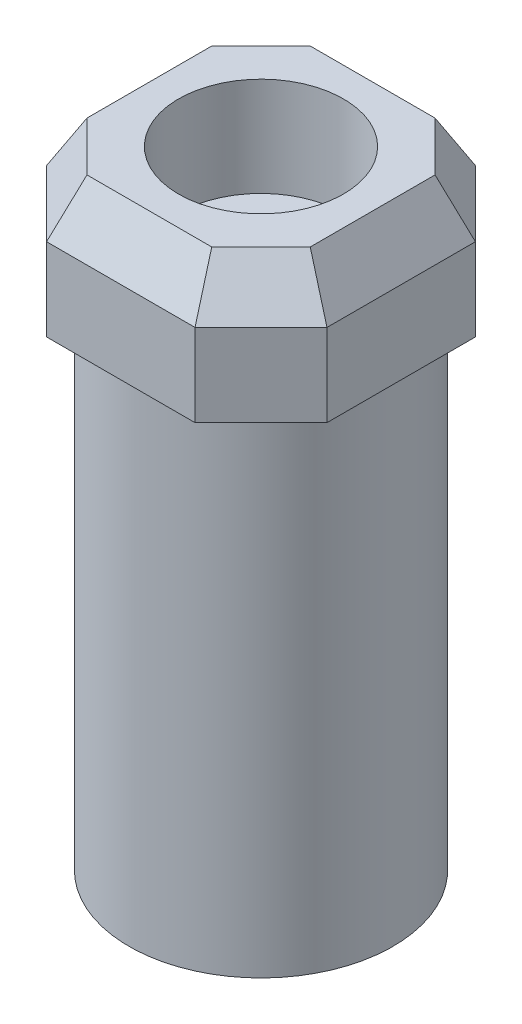
ISO-10303-21;
HEADER;
FILE_DESCRIPTION(('STEP AP214'),'2;1');
FILE_NAME('part.step','',(''),(''),'','','');
FILE_SCHEMA(('AUTOMOTIVE_DESIGN { 1 0 10303 214 1 1 1 1 }'));
ENDSEC;
DATA;
#1=APPLICATION_CONTEXT('core data for automotive mechanical design processes');
#2=APPLICATION_PROTOCOL_DEFINITION('international standard','automotive_design',2000,#1);
#3=PRODUCT_CONTEXT('',#1,'mechanical');
#4=PRODUCT('Part','Part','',(#3));
#5=PRODUCT_RELATED_PRODUCT_CATEGORY('part','',(#4));
#6=PRODUCT_DEFINITION_FORMATION('','',#4);
#7=PRODUCT_DEFINITION_CONTEXT('part definition',#1,'design');
#8=PRODUCT_DEFINITION('design','',#6,#7);
#9=PRODUCT_DEFINITION_SHAPE('','',#8);
#10=(LENGTH_UNIT() NAMED_UNIT(*) SI_UNIT(.MILLI.,.METRE.));
#11=(NAMED_UNIT(*) PLANE_ANGLE_UNIT() SI_UNIT($,.RADIAN.));
#12=(NAMED_UNIT(*) SI_UNIT($,.STERADIAN.) SOLID_ANGLE_UNIT());
#13=UNCERTAINTY_MEASURE_WITH_UNIT(LENGTH_MEASURE(1.E-05),#10,'distance_accuracy_value','');
#14=(GEOMETRIC_REPRESENTATION_CONTEXT(3) GLOBAL_UNCERTAINTY_ASSIGNED_CONTEXT((#13)) GLOBAL_UNIT_ASSIGNED_CONTEXT((#10,
#11,#12)) REPRESENTATION_CONTEXT('',''));
#15=CARTESIAN_POINT('',(0.,0.,0.));
#16=DIRECTION('',(0.,0.,1.));
#17=DIRECTION('',(1.,0.,0.));
#18=AXIS2_PLACEMENT_3D('',#15,#16,#17);
#19=CARTESIAN_POINT('',(8.5,8.,-8.5));
#20=DIRECTION('',(-1.,0.,0.));
#21=DIRECTION('',(0.,0.,1.));
#22=AXIS2_PLACEMENT_3D('',#19,#20,#21);
#23=PLANE('',#22);
#24=DIRECTION('',(0.,1.,0.));
#25=VECTOR('',#24,1.);
#26=CARTESIAN_POINT('',(8.5,8.,-4.49999999999999));
#27=LINE('',#26,#25);
#28=CARTESIAN_POINT('',(8.5,0.,-4.49999999999999));
#29=VERTEX_POINT('',#28);
#30=CARTESIAN_POINT('',(8.5,4.99999999999998,-4.49999999999999));
#31=VERTEX_POINT('',#30);
#32=EDGE_CURVE('E393',#29,#31,#27,.T.);
#33=ORIENTED_EDGE('',*,*,#32,.T.);
#34=DIRECTION('',(0.,0.,1.));
#35=VECTOR('',#34,1.);
#36=CARTESIAN_POINT('',(8.5,4.99999999999998,4.5));
#37=LINE('',#36,#35);
#38=CARTESIAN_POINT('',(8.5,4.99999999999998,4.5));
#39=VERTEX_POINT('',#38);
#40=EDGE_CURVE('E59',#31,#39,#37,.T.);
#41=ORIENTED_EDGE('',*,*,#40,.T.);
#42=DIRECTION('',(0.,-1.,0.));
#43=VECTOR('',#42,1.);
#44=CARTESIAN_POINT('',(8.5,8.,4.5));
#45=LINE('',#44,#43);
#46=CARTESIAN_POINT('',(8.5,0.,4.5));
#47=VERTEX_POINT('',#46);
#48=EDGE_CURVE('E391',#39,#47,#45,.T.);
#49=ORIENTED_EDGE('',*,*,#48,.T.);
#50=DIRECTION('',(0.,0.,-1.));
#51=VECTOR('',#50,1.);
#52=CARTESIAN_POINT('',(8.5,0.,-8.5));
#53=LINE('',#52,#51);
#54=EDGE_CURVE('E435',#47,#29,#53,.T.);
#55=ORIENTED_EDGE('',*,*,#54,.T.);
#56=EDGE_LOOP('',(#33,#41,#49,#55));
#57=FACE_BOUND('',#56,.T.);
#58=ADVANCED_FACE('F35',(#57),#23,.F.);
#59=CARTESIAN_POINT('',(-8.5,8.,-8.5));
#60=DIRECTION('',(0.,0.,1.));
#61=DIRECTION('',(1.,0.,0.));
#62=AXIS2_PLACEMENT_3D('',#59,#60,#61);
#63=PLANE('',#62);
#64=DIRECTION('',(0.,1.,0.));
#65=VECTOR('',#64,1.);
#66=CARTESIAN_POINT('',(-4.49999999999999,8.,-8.5));
#67=LINE('',#66,#65);
#68=CARTESIAN_POINT('',(-4.49999999999999,0.,-8.5));
#69=VERTEX_POINT('',#68);
#70=CARTESIAN_POINT('',(-4.49999999999999,4.99999999999998,-8.5));
#71=VERTEX_POINT('',#70);
#72=EDGE_CURVE('E386',#69,#71,#67,.T.);
#73=ORIENTED_EDGE('',*,*,#72,.T.);
#74=DIRECTION('',(1.,0.,0.));
#75=VECTOR('',#74,1.);
#76=CARTESIAN_POINT('',(4.5,4.99999999999998,-8.5));
#77=LINE('',#76,#75);
#78=CARTESIAN_POINT('',(4.5,4.99999999999998,-8.5));
#79=VERTEX_POINT('',#78);
#80=EDGE_CURVE('E333',#71,#79,#77,.T.);
#81=ORIENTED_EDGE('',*,*,#80,.T.);
#82=DIRECTION('',(0.,-1.,0.));
#83=VECTOR('',#82,1.);
#84=CARTESIAN_POINT('',(4.5,8.,-8.5));
#85=LINE('',#84,#83);
#86=CARTESIAN_POINT('',(4.5,0.,-8.5));
#87=VERTEX_POINT('',#86);
#88=EDGE_CURVE('E389',#79,#87,#85,.T.);
#89=ORIENTED_EDGE('',*,*,#88,.T.);
#90=DIRECTION('',(-1.,0.,0.));
#91=VECTOR('',#90,1.);
#92=CARTESIAN_POINT('',(-8.5,0.,-8.5));
#93=LINE('',#92,#91);
#94=EDGE_CURVE('E431',#87,#69,#93,.T.);
#95=ORIENTED_EDGE('',*,*,#94,.T.);
#96=EDGE_LOOP('',(#73,#81,#89,#95));
#97=FACE_BOUND('',#96,.T.);
#98=ADVANCED_FACE('F275',(#97),#63,.F.);
#99=CARTESIAN_POINT('',(-8.5,8.,-8.5));
#100=DIRECTION('',(1.,0.,0.));
#101=DIRECTION('',(0.,0.,-1.));
#102=AXIS2_PLACEMENT_3D('',#99,#100,#101);
#103=PLANE('',#102);
#104=DIRECTION('',(0.,1.,0.));
#105=VECTOR('',#104,1.);
#106=CARTESIAN_POINT('',(-8.5,8.,4.49999999999999));
#107=LINE('',#106,#105);
#108=CARTESIAN_POINT('',(-8.5,0.,4.49999999999999));
#109=VERTEX_POINT('',#108);
#110=CARTESIAN_POINT('',(-8.5,4.99999999999998,4.49999999999999));
#111=VERTEX_POINT('',#110);
#112=EDGE_CURVE('E395',#109,#111,#107,.T.);
#113=ORIENTED_EDGE('',*,*,#112,.T.);
#114=DIRECTION('',(0.,0.,-1.));
#115=VECTOR('',#114,1.);
#116=CARTESIAN_POINT('',(-8.5,4.99999999999998,-4.5));
#117=LINE('',#116,#115);
#118=CARTESIAN_POINT('',(-8.5,4.99999999999998,-4.5));
#119=VERTEX_POINT('',#118);
#120=EDGE_CURVE('E365',#111,#119,#117,.T.);
#121=ORIENTED_EDGE('',*,*,#120,.T.);
#122=DIRECTION('',(0.,-1.,0.));
#123=VECTOR('',#122,1.);
#124=CARTESIAN_POINT('',(-8.5,8.,-4.5));
#125=LINE('',#124,#123);
#126=CARTESIAN_POINT('',(-8.5,0.,-4.5));
#127=VERTEX_POINT('',#126);
#128=EDGE_CURVE('E398',#119,#127,#125,.T.);
#129=ORIENTED_EDGE('',*,*,#128,.T.);
#130=DIRECTION('',(0.,0.,1.));
#131=VECTOR('',#130,1.);
#132=CARTESIAN_POINT('',(-8.5,0.,-8.5));
#133=LINE('',#132,#131);
#134=EDGE_CURVE('E428',#127,#109,#133,.T.);
#135=ORIENTED_EDGE('',*,*,#134,.T.);
#136=EDGE_LOOP('',(#113,#121,#129,#135));
#137=FACE_BOUND('',#136,.T.);
#138=ADVANCED_FACE('F271',(#137),#103,.F.);
#139=CARTESIAN_POINT('',(-8.5,8.,8.5));
#140=DIRECTION('',(0.,0.,-1.));
#141=DIRECTION('',(-1.,0.,0.));
#142=AXIS2_PLACEMENT_3D('',#139,#140,#141);
#143=PLANE('',#142);
#144=DIRECTION('',(0.,1.,0.));
#145=VECTOR('',#144,1.);
#146=CARTESIAN_POINT('',(4.49999999999999,8.,8.5));
#147=LINE('',#146,#145);
#148=CARTESIAN_POINT('',(4.49999999999999,0.,8.5));
#149=VERTEX_POINT('',#148);
#150=CARTESIAN_POINT('',(4.49999999999999,4.99999999999998,8.5));
#151=VERTEX_POINT('',#150);
#152=EDGE_CURVE('E210',#149,#151,#147,.T.);
#153=ORIENTED_EDGE('',*,*,#152,.T.);
#154=DIRECTION('',(-1.,0.,0.));
#155=VECTOR('',#154,1.);
#156=CARTESIAN_POINT('',(-4.5,4.99999999999998,8.5));
#157=LINE('',#156,#155);
#158=CARTESIAN_POINT('',(-4.5,4.99999999999998,8.5));
#159=VERTEX_POINT('',#158);
#160=EDGE_CURVE('E11',#151,#159,#157,.T.);
#161=ORIENTED_EDGE('',*,*,#160,.T.);
#162=DIRECTION('',(0.,-1.,0.));
#163=VECTOR('',#162,1.);
#164=CARTESIAN_POINT('',(-4.5,8.,8.5));
#165=LINE('',#164,#163);
#166=CARTESIAN_POINT('',(-4.5,0.,8.5));
#167=VERTEX_POINT('',#166);
#168=EDGE_CURVE('E407',#159,#167,#165,.T.);
#169=ORIENTED_EDGE('',*,*,#168,.T.);
#170=DIRECTION('',(1.,0.,0.));
#171=VECTOR('',#170,1.);
#172=CARTESIAN_POINT('',(-8.5,0.,8.5));
#173=LINE('',#172,#171);
#174=EDGE_CURVE('E414',#167,#149,#173,.T.);
#175=ORIENTED_EDGE('',*,*,#174,.T.);
#176=EDGE_LOOP('',(#153,#161,#169,#175));
#177=FACE_BOUND('',#176,.T.);
#178=ADVANCED_FACE('F263',(#177),#143,.F.);
#179=CARTESIAN_POINT('',(0.,8.,0.));
#180=DIRECTION('',(0.,1.,0.));
#181=DIRECTION('',(0.,0.,1.));
#182=AXIS2_PLACEMENT_3D('',#179,#180,#181);
#183=PLANE('',#182);
#184=DIRECTION('',(0.,0.,1.));
#185=VECTOR('',#184,1.);
#186=CARTESIAN_POINT('',(-6.76794919243112,8.,4.49999999999999));
#187=LINE('',#186,#185);
#188=CARTESIAN_POINT('',(-6.76794919243112,8.,-3.7825610647857));
#189=VERTEX_POINT('',#188);
#190=CARTESIAN_POINT('',(-6.76794919243112,8.,3.78256106478569));
#191=VERTEX_POINT('',#190);
#192=EDGE_CURVE('E373',#189,#191,#187,.T.);
#193=ORIENTED_EDGE('',*,*,#192,.T.);
#194=DIRECTION('',(0.707106781186546,0.,0.707106781186549));
#195=VECTOR('',#194,1.);
#196=CARTESIAN_POINT('',(-5.27525512860842,8.,5.2752551286084));
#197=LINE('',#196,#195);
#198=CARTESIAN_POINT('',(-3.7825610647857,8.,6.76794919243112));
#199=VERTEX_POINT('',#198);
#200=EDGE_CURVE('E370',#191,#199,#197,.T.);
#201=ORIENTED_EDGE('',*,*,#200,.T.);
#202=DIRECTION('',(1.,0.,0.));
#203=VECTOR('',#202,1.);
#204=CARTESIAN_POINT('',(4.49999999999999,8.,6.76794919243112));
#205=LINE('',#204,#203);
#206=CARTESIAN_POINT('',(3.78256106478569,8.,6.76794919243112));
#207=VERTEX_POINT('',#206);
#208=EDGE_CURVE('E384',#199,#207,#205,.T.);
#209=ORIENTED_EDGE('',*,*,#208,.T.);
#210=DIRECTION('',(0.707106781186549,0.,-0.707106781186546));
#211=VECTOR('',#210,1.);
#212=CARTESIAN_POINT('',(5.2752551286084,8.,5.27525512860842));
#213=LINE('',#212,#211);
#214=CARTESIAN_POINT('',(6.76794919243112,8.,3.7825610647857));
#215=VERTEX_POINT('',#214);
#216=EDGE_CURVE('E382',#207,#215,#213,.T.);
#217=ORIENTED_EDGE('',*,*,#216,.T.);
#218=DIRECTION('',(0.,0.,-1.));
#219=VECTOR('',#218,1.);
#220=CARTESIAN_POINT('',(6.76794919243112,8.,-4.49999999999999));
#221=LINE('',#220,#219);
#222=CARTESIAN_POINT('',(6.76794919243112,8.,-3.78256106478569));
#223=VERTEX_POINT('',#222);
#224=EDGE_CURVE('E380',#215,#223,#221,.T.);
#225=ORIENTED_EDGE('',*,*,#224,.T.);
#226=DIRECTION('',(-0.707106781186546,0.,-0.707106781186549));
#227=VECTOR('',#226,1.);
#228=CARTESIAN_POINT('',(5.27525512860842,8.,-5.2752551286084));
#229=LINE('',#228,#227);
#230=CARTESIAN_POINT('',(3.7825610647857,8.,-6.76794919243112));
#231=VERTEX_POINT('',#230);
#232=EDGE_CURVE('E378',#223,#231,#229,.T.);
#233=ORIENTED_EDGE('',*,*,#232,.T.);
#234=DIRECTION('',(-1.,0.,0.));
#235=VECTOR('',#234,1.);
#236=CARTESIAN_POINT('',(-4.49999999999999,8.,-6.76794919243112));
#237=LINE('',#236,#235);
#238=CARTESIAN_POINT('',(-3.78256106478569,8.,-6.76794919243112));
#239=VERTEX_POINT('',#238);
#240=EDGE_CURVE('E335',#231,#239,#237,.T.);
#241=ORIENTED_EDGE('',*,*,#240,.T.);
#242=DIRECTION('',(-0.707106781186549,0.,0.707106781186546));
#243=VECTOR('',#242,1.);
#244=CARTESIAN_POINT('',(-5.2752551286084,8.,-5.27525512860842));
#245=LINE('',#244,#243);
#246=EDGE_CURVE('E375',#239,#189,#245,.T.);
#247=ORIENTED_EDGE('',*,*,#246,.T.);
#248=EDGE_LOOP('',(#193,#201,#209,#217,#225,#233,#241,#247));
#249=FACE_BOUND('',#248,.T.);
#250=CARTESIAN_POINT('',(0.,8.,0.));
#251=DIRECTION('',(0.,1.,0.));
#252=DIRECTION('',(0.,0.,1.));
#253=AXIS2_PLACEMENT_3D('',#250,#251,#252);
#254=CIRCLE('',#253,5.);
#255=CARTESIAN_POINT('',(0.,8.,5.));
#256=VERTEX_POINT('',#255);
#257=EDGE_CURVE('E246',#256,#256,#254,.T.);
#258=ORIENTED_EDGE('',*,*,#257,.F.);
#259=EDGE_LOOP('',(#258));
#260=FACE_BOUND('',#259,.T.);
#261=ADVANCED_FACE('F260',(#249,#260),#183,.T.);
#262=CARTESIAN_POINT('',(0.,0.,0.));
#263=DIRECTION('',(0.,1.,0.));
#264=DIRECTION('',(0.,0.,1.));
#265=AXIS2_PLACEMENT_3D('',#262,#263,#264);
#266=PLANE('',#265);
#267=CARTESIAN_POINT('',(0.,0.,0.));
#268=DIRECTION('',(0.,-1.,0.));
#269=DIRECTION('',(0.,0.,-1.));
#270=AXIS2_PLACEMENT_3D('',#267,#268,#269);
#271=CIRCLE('',#270,8.);
#272=CARTESIAN_POINT('',(0.,0.,-8.));
#273=VERTEX_POINT('',#272);
#274=EDGE_CURVE('E433',#273,#273,#271,.T.);
#275=ORIENTED_EDGE('',*,*,#274,.F.);
#276=EDGE_LOOP('',(#275));
#277=FACE_BOUND('',#276,.T.);
#278=ORIENTED_EDGE('',*,*,#174,.F.);
#279=DIRECTION('',(0.707106781186546,0.,0.707106781186549));
#280=VECTOR('',#279,1.);
#281=CARTESIAN_POINT('',(-4.5,0.,8.5));
#282=LINE('',#281,#280);
#283=EDGE_CURVE('E400',#167,#109,#282,.F.);
#284=ORIENTED_EDGE('',*,*,#283,.T.);
#285=ORIENTED_EDGE('',*,*,#134,.F.);
#286=DIRECTION('',(-0.707106781186549,0.,0.707106781186546));
#287=VECTOR('',#286,1.);
#288=CARTESIAN_POINT('',(-8.5,0.,-4.5));
#289=LINE('',#288,#287);
#290=EDGE_CURVE('E404',#127,#69,#289,.F.);
#291=ORIENTED_EDGE('',*,*,#290,.T.);
#292=ORIENTED_EDGE('',*,*,#94,.F.);
#293=DIRECTION('',(-0.707106781186546,0.,-0.707106781186549));
#294=VECTOR('',#293,1.);
#295=CARTESIAN_POINT('',(4.5,0.,-8.5));
#296=LINE('',#295,#294);
#297=EDGE_CURVE('E406',#87,#29,#296,.F.);
#298=ORIENTED_EDGE('',*,*,#297,.T.);
#299=ORIENTED_EDGE('',*,*,#54,.F.);
#300=DIRECTION('',(0.707106781186549,0.,-0.707106781186546));
#301=VECTOR('',#300,1.);
#302=CARTESIAN_POINT('',(8.5,0.,4.5));
#303=LINE('',#302,#301);
#304=EDGE_CURVE('E402',#47,#149,#303,.F.);
#305=ORIENTED_EDGE('',*,*,#304,.T.);
#306=EDGE_LOOP('',(#278,#284,#285,#291,#292,#298,#299,#305));
#307=FACE_BOUND('',#306,.T.);
#308=ADVANCED_FACE('F262',(#277,#307),#266,.F.);
#309=CARTESIAN_POINT('',(0.,-30.,0.));
#310=DIRECTION('',(0.,1.,0.));
#311=DIRECTION('',(0.,0.,1.));
#312=AXIS2_PLACEMENT_3D('',#309,#310,#311);
#313=CYLINDRICAL_SURFACE('',#312,8.);
#314=DIRECTION('',(0.,1.,0.));
#315=VECTOR('',#314,1.);
#316=CARTESIAN_POINT('',(-7.87654746700609,-30.,-1.4));
#317=LINE('',#316,#315);
#318=CARTESIAN_POINT('',(-7.87654746700609,-20.,-1.4));
#319=VERTEX_POINT('',#318);
#320=CARTESIAN_POINT('',(-7.87654746700609,-9.99999999999999,-1.4));
#321=VERTEX_POINT('',#320);
#322=EDGE_CURVE('E176',#319,#321,#317,.T.);
#323=ORIENTED_EDGE('',*,*,#322,.T.);
#324=CARTESIAN_POINT('',(-7.87654746700609,-9.99999999999999,-1.4));
#325=CARTESIAN_POINT('',(-7.87654574469843,-9.96093397030719,-1.40000009786618));
#326=CARTESIAN_POINT('',(-7.8768384762062,-9.92188695701644,-1.39836380016015));
#327=CARTESIAN_POINT('',(-7.8779948217706,-9.84407833734187,-1.39183829938028));
#328=CARTESIAN_POINT('',(-7.87885837556585,-9.80531670126767,-1.38694943967712));
#329=CARTESIAN_POINT('',(-7.8822732761393,-9.6899892529084,-1.36746218160885));
#330=CARTESIAN_POINT('',(-7.88564901953597,-9.61420543913664,-1.3480428980196));
#331=CARTESIAN_POINT('',(-7.89421512934006,-9.4670385735415,-1.29693109800066));
#332=CARTESIAN_POINT('',(-7.89940584831672,-9.39565637992921,-1.26523619683416));
#333=CARTESIAN_POINT('',(-7.91101449635689,-9.25920739075039,-1.19049353674434));
#334=CARTESIAN_POINT('',(-7.91743246739731,-9.19414081131783,-1.14744538947564));
#335=CARTESIAN_POINT('',(-7.93084923122589,-9.07149091891836,-1.05072823535329));
#336=CARTESIAN_POINT('',(-7.93785301176315,-9.01398550560457,-0.996961164059506));
#337=CARTESIAN_POINT('',(-7.95160880716072,-8.90875743349266,-0.880537997859972));
#338=CARTESIAN_POINT('',(-7.95836078321537,-8.8610362774935,-0.817880539945022));
#339=CARTESIAN_POINT('',(-7.97090502697085,-8.77644188998031,-0.684947077776653));
#340=CARTESIAN_POINT('',(-7.976690681629,-8.73964216771898,-0.614623618589111));
#341=CARTESIAN_POINT('',(-7.98659394079379,-8.67840974350942,-0.468678770975305));
#342=CARTESIAN_POINT('',(-7.99071175859141,-8.65397546010981,-0.393058061438554));
#343=CARTESIAN_POINT('',(-7.99678029416812,-8.61840614341496,-0.239475359665924));
#344=CARTESIAN_POINT('',(-7.99875256213273,-8.60713877306312,-0.161544881809643));
#345=CARTESIAN_POINT('',(-8.0003819333325,-8.59781120881386,-0.00487445683871393));
#346=CARTESIAN_POINT('',(-8.00003915468235,-8.59975034111497,0.0738654487739149));
#347=CARTESIAN_POINT('',(-7.99709394178176,-8.6166786850046,0.229009686691875));
#348=CARTESIAN_POINT('',(-7.99451623364918,-8.63152510187836,0.305430136669221));
#349=CARTESIAN_POINT('',(-7.98741844860293,-8.67362124959126,0.454677627425671));
#350=CARTESIAN_POINT('',(-7.98289832069316,-8.70087130607544,0.527504573805323));
#351=CARTESIAN_POINT('',(-7.97238168375758,-8.7671413324401,0.667920102703323));
#352=CARTESIAN_POINT('',(-7.96637788183609,-8.80621966338937,0.735480572674119));
#353=CARTESIAN_POINT('',(-7.95356006477443,-8.8949927822457,0.863136260712703));
#354=CARTESIAN_POINT('',(-7.94674600670749,-8.94468813274591,0.923231082910747));
#355=CARTESIAN_POINT('',(-7.93295739936767,-9.05406710229683,1.03508974126972));
#356=CARTESIAN_POINT('',(-7.9259819198816,-9.11387434221804,1.08673264037877));
#357=CARTESIAN_POINT('',(-7.91274159538071,-9.24138780999238,1.17928532325297));
#358=CARTESIAN_POINT('',(-7.90647695165362,-9.30909626428114,1.22019207114118));
#359=CARTESIAN_POINT('',(-7.89536581227968,-9.45064781489396,1.29013963762815));
#360=CARTESIAN_POINT('',(-7.89052202646695,-9.52450229300594,1.31915782383543));
#361=CARTESIAN_POINT('',(-7.88284318592593,-9.67609155180291,1.36430073711403));
#362=CARTESIAN_POINT('',(-7.8800051322167,-9.75382035247864,1.38044471842302));
#363=CARTESIAN_POINT('',(-7.87773953725719,-9.86012293076048,1.393278781654));
#364=CARTESIAN_POINT('',(-7.87729293093619,-9.88806168482209,1.39580025127285));
#365=CARTESIAN_POINT('',(-7.8766971845825,-9.9439961894872,1.3991586844045));
#366=CARTESIAN_POINT('',(-7.87654754447313,-9.97199176466891,1.39999847979662));
#367=CARTESIAN_POINT('',(-7.87654746700609,-10.,1.4));
#368=B_SPLINE_CURVE_WITH_KNOTS('',3,(#324,#325,#326,#327,#328,#329,#330,#331,#332,#333,#334,
#335,#336,#337,#338,#339,#340,#341,#342,#343,#344,#345,#346,#347,#348,#349,#350,#351,#352,#353,
#354,#355,#356,#357,#358,#359,#360,#361,#362,#363,#364,#365,#366,#367),.UNSPECIFIED.,.F.,.F.,(4,
2,2,2,2,2,2,2,2,2,2,2,2,2,2,2,2,2,2,2,2,4),(0.,0.117125139690623,0.234237916524813,
0.467943868104823,0.701695243628187,0.935454615811017,1.17145978462551,1.40750117520477,
1.64509702944765,1.88266248919239,2.11781912824827,2.35296376960083,2.58553961465608,
2.81812156610757,3.05187032668944,3.28563147663181,3.52248998747965,3.75941540316371,
3.99678978380537,4.2338084858226,4.31793672944708,4.40192318457736),.UNSPECIFIED.);
#369=CARTESIAN_POINT('',(-7.87654746700609,-10.,1.4));
#370=VERTEX_POINT('',#369);
#371=EDGE_CURVE('E166',#321,#370,#368,.T.);
#372=ORIENTED_EDGE('',*,*,#371,.T.);
#373=DIRECTION('',(0.,1.,0.));
#374=VECTOR('',#373,1.);
#375=CARTESIAN_POINT('',(-7.87654746700609,-30.,1.4));
#376=LINE('',#375,#374);
#377=CARTESIAN_POINT('',(-7.87654746700609,-20.,1.4));
#378=VERTEX_POINT('',#377);
#379=EDGE_CURVE('E149',#370,#378,#376,.F.);
#380=ORIENTED_EDGE('',*,*,#379,.T.);
#381=CARTESIAN_POINT('',(-7.87654746700609,-20.,1.4));
#382=CARTESIAN_POINT('',(-7.87654574469844,-20.0390660296928,1.40000009786618));
#383=CARTESIAN_POINT('',(-7.87683847620621,-20.0781130429836,1.39836380016014));
#384=CARTESIAN_POINT('',(-7.8779948217706,-20.1559216626581,1.39183829938028));
#385=CARTESIAN_POINT('',(-7.87885837556585,-20.1946832987323,1.38694943967712));
#386=CARTESIAN_POINT('',(-7.8822732761393,-20.3100107470916,1.36746218160885));
#387=CARTESIAN_POINT('',(-7.88564901953597,-20.3857945608634,1.3480428980196));
#388=CARTESIAN_POINT('',(-7.89421512934006,-20.5329614264585,1.29693109800066));
#389=CARTESIAN_POINT('',(-7.89940584831672,-20.6043436200708,1.26523619683416));
#390=CARTESIAN_POINT('',(-7.91101449635689,-20.7407926092496,1.19049353674434));
#391=CARTESIAN_POINT('',(-7.91743246739731,-20.8058591886822,1.14744538947564));
#392=CARTESIAN_POINT('',(-7.93084923122589,-20.9285090810816,1.0507282353533));
#393=CARTESIAN_POINT('',(-7.93785301176315,-20.9860144943954,0.99696116405951));
#394=CARTESIAN_POINT('',(-7.95160880716072,-21.0912425665073,0.880537997859976));
#395=CARTESIAN_POINT('',(-7.95836078321537,-21.1389637225065,0.817880539945025));
#396=CARTESIAN_POINT('',(-7.97090502697085,-21.2235581100197,0.684947077776657));
#397=CARTESIAN_POINT('',(-7.976690681629,-21.260357832281,0.614623618589116));
#398=CARTESIAN_POINT('',(-7.98659394079379,-21.3215902564906,0.468678770975312));
#399=CARTESIAN_POINT('',(-7.99071175859141,-21.3460245398902,0.393058061438562));
#400=CARTESIAN_POINT('',(-7.99678029416812,-21.381593856585,0.239475359665932));
#401=CARTESIAN_POINT('',(-7.99875256213273,-21.3928612269369,0.16154488180965));
#402=CARTESIAN_POINT('',(-8.0003819333325,-21.4021887911861,0.00487445683872125));
#403=CARTESIAN_POINT('',(-8.00003915468235,-21.400249658885,-0.0738654487739076));
#404=CARTESIAN_POINT('',(-7.99709394178176,-21.3833213149954,-0.229009686691868));
#405=CARTESIAN_POINT('',(-7.99451623364918,-21.3684748981216,-0.305430136669214));
#406=CARTESIAN_POINT('',(-7.98741844860293,-21.3263787504087,-0.454677627425665));
#407=CARTESIAN_POINT('',(-7.98289832069316,-21.2991286939246,-0.527504573805317));
#408=CARTESIAN_POINT('',(-7.97238168375758,-21.2328586675599,-0.667920102703318));
#409=CARTESIAN_POINT('',(-7.96637788183609,-21.1937803366106,-0.735480572674115));
#410=CARTESIAN_POINT('',(-7.95356006477443,-21.1050072177543,-0.8631362607127));
#411=CARTESIAN_POINT('',(-7.94674600670749,-21.0553118672541,-0.923231082910742));
#412=CARTESIAN_POINT('',(-7.93295739936767,-20.9459328977032,-1.03508974126972));
#413=CARTESIAN_POINT('',(-7.9259819198816,-20.886125657782,-1.08673264037876));
#414=CARTESIAN_POINT('',(-7.91274159538071,-20.7586121900076,-1.17928532325297));
#415=CARTESIAN_POINT('',(-7.90647695165362,-20.6909037357189,-1.22019207114118));
#416=CARTESIAN_POINT('',(-7.89536581227968,-20.5493521851061,-1.29013963762815));
#417=CARTESIAN_POINT('',(-7.89052202646695,-20.4754977069941,-1.31915782383543));
#418=CARTESIAN_POINT('',(-7.88284318592593,-20.3239084481971,-1.36430073711404));
#419=CARTESIAN_POINT('',(-7.8800051322167,-20.2461796475214,-1.38044471842302));
#420=CARTESIAN_POINT('',(-7.87773953725719,-20.1398770692395,-1.393278781654));
#421=CARTESIAN_POINT('',(-7.87729293093619,-20.1119383151779,-1.39580025127285));
#422=CARTESIAN_POINT('',(-7.8766971845825,-20.0560038105128,-1.39915868440451));
#423=CARTESIAN_POINT('',(-7.87654754447313,-20.0280082353311,-1.39999847979662));
#424=CARTESIAN_POINT('',(-7.87654746700609,-20.,-1.4));
#425=B_SPLINE_CURVE_WITH_KNOTS('',3,(#381,#382,#383,#384,#385,#386,#387,#388,#389,#390,#391,
#392,#393,#394,#395,#396,#397,#398,#399,#400,#401,#402,#403,#404,#405,#406,#407,#408,#409,#410,
#411,#412,#413,#414,#415,#416,#417,#418,#419,#420,#421,#422,#423,#424),.UNSPECIFIED.,.F.,.F.,(4,
2,2,2,2,2,2,2,2,2,2,2,2,2,2,2,2,2,2,2,2,4),(0.,0.117125139690619,0.23423791652481,
0.46794386810482,0.701695243628182,0.935454615811014,1.1714597846255,1.40750117520477,
1.64509702944765,1.88266248919238,2.11781912824827,2.35296376960083,2.58553961465607,
2.81812156610756,3.05187032668944,3.28563147663181,3.52248998747965,3.7594154031637,
3.99678978380536,4.23380848582259,4.31793672944709,4.40192318457736),.UNSPECIFIED.);
#426=EDGE_CURVE('E160',#378,#319,#425,.T.);
#427=ORIENTED_EDGE('',*,*,#426,.T.);
#428=EDGE_LOOP('',(#323,#372,#380,#427));
#429=FACE_BOUND('',#428,.T.);
#430=CARTESIAN_POINT('',(0.,-30.,0.));
#431=DIRECTION('',(0.,-1.,0.));
#432=DIRECTION('',(0.,0.,-1.));
#433=AXIS2_PLACEMENT_3D('',#430,#431,#432);
#434=CIRCLE('',#433,8.);
#435=CARTESIAN_POINT('',(0.,-30.,-8.));
#436=VERTEX_POINT('',#435);
#437=EDGE_CURVE('E440',#436,#436,#434,.T.);
#438=ORIENTED_EDGE('',*,*,#437,.F.);
#439=EDGE_LOOP('',(#438));
#440=FACE_BOUND('',#439,.T.);
#441=ORIENTED_EDGE('',*,*,#274,.T.);
#442=EDGE_LOOP('',(#441));
#443=FACE_BOUND('',#442,.T.);
#444=ADVANCED_FACE('F174',(#429,#440,#443),#313,.T.);
#445=CARTESIAN_POINT('',(0.,-30.,0.));
#446=DIRECTION('',(0.,-1.,0.));
#447=DIRECTION('',(0.,0.,-1.));
#448=AXIS2_PLACEMENT_3D('',#445,#446,#447);
#449=PLANE('',#448);
#450=CARTESIAN_POINT('',(0.,-30.,0.));
#451=DIRECTION('',(0.,-1.,0.));
#452=DIRECTION('',(0.,0.,-1.));
#453=AXIS2_PLACEMENT_3D('',#450,#451,#452);
#454=CIRCLE('',#453,6.);
#455=CARTESIAN_POINT('',(0.,-30.,-6.));
#456=VERTEX_POINT('',#455);
#457=EDGE_CURVE('E177',#456,#456,#454,.T.);
#458=ORIENTED_EDGE('',*,*,#457,.F.);
#459=EDGE_LOOP('',(#458));
#460=FACE_BOUND('',#459,.T.);
#461=ORIENTED_EDGE('',*,*,#437,.T.);
#462=EDGE_LOOP('',(#461));
#463=FACE_BOUND('',#462,.T.);
#464=ADVANCED_FACE('F217',(#460,#463),#449,.T.);
#465=CARTESIAN_POINT('',(0.,0.,0.));
#466=DIRECTION('',(0.,-1.,0.));
#467=DIRECTION('',(0.,0.,-1.));
#468=AXIS2_PLACEMENT_3D('',#465,#466,#467);
#469=CYLINDRICAL_SURFACE('',#468,6.);
#470=DIRECTION('',(0.,-1.,0.));
#471=VECTOR('',#470,1.);
#472=CARTESIAN_POINT('',(-5.83438085832593,0.,1.4));
#473=LINE('',#472,#471);
#474=CARTESIAN_POINT('',(-5.83438085832593,-20.,1.4));
#475=VERTEX_POINT('',#474);
#476=CARTESIAN_POINT('',(-5.83438085832593,-10.,1.4));
#477=VERTEX_POINT('',#476);
#478=EDGE_CURVE('E227',#475,#477,#473,.F.);
#479=ORIENTED_EDGE('',*,*,#478,.T.);
#480=CARTESIAN_POINT('',(-5.83438085832593,-10.,1.4));
#481=CARTESIAN_POINT('',(-5.83437846201458,-9.96118613366395,1.40000037772824));
#482=CARTESIAN_POINT('',(-5.83476867136051,-9.92239141126499,1.39838484870622));
#483=CARTESIAN_POINT('',(-5.83630945832851,-9.84509040611187,1.39194403772017));
#484=CARTESIAN_POINT('',(-5.8374599202632,-9.80658408037395,1.38711924410805));
#485=CARTESIAN_POINT('',(-5.84200642232275,-9.6920614300316,1.36789794314109));
#486=CARTESIAN_POINT('',(-5.84649784387101,-9.61682937855985,1.34875423592067));
#487=CARTESIAN_POINT('',(-5.85788133560829,-9.47076063888988,1.29841557792622));
#488=CARTESIAN_POINT('',(-5.86477335705228,-9.39992386147847,1.26722087185054));
#489=CARTESIAN_POINT('',(-5.88017766143997,-9.26445851806589,1.19369878779683));
#490=CARTESIAN_POINT('',(-5.88869028387612,-9.19983125714453,1.15136907648584));
#491=CARTESIAN_POINT('',(-5.90655731639286,-9.07741882754834,1.05592213770688));
#492=CARTESIAN_POINT('',(-5.91592365017565,-9.01976985752687,1.0026325106791));
#493=CARTESIAN_POINT('',(-5.93433969227616,-8.914136899892,0.887144913548661));
#494=CARTESIAN_POINT('',(-5.94338935043936,-8.86615443756938,0.824945540210823));
#495=CARTESIAN_POINT('',(-5.96028337528445,-8.78067222623086,0.692478628149271));
#496=CARTESIAN_POINT('',(-5.96811191838561,-8.74330564484803,0.622122965150121));
#497=CARTESIAN_POINT('',(-5.98154500215222,-8.68098076190101,0.475920515940142));
#498=CARTESIAN_POINT('',(-5.98714994128219,-8.65602023699834,0.400074716431676));
#499=CARTESIAN_POINT('',(-5.99542001771875,-8.61964812960261,0.246469285761876));
#500=CARTESIAN_POINT('',(-5.99813552953555,-8.60800410723533,0.168767452281304));
#501=CARTESIAN_POINT('',(-6.00049580900715,-8.59786740648299,0.0124672090991966));
#502=CARTESIAN_POINT('',(-6.00014090511837,-8.59937332138911,-0.066131103803498));
#503=CARTESIAN_POINT('',(-5.99643827007719,-8.61532381533981,-0.220382756587401));
#504=CARTESIAN_POINT('',(-5.99314859978632,-8.62951739489067,-0.29606365217749));
#505=CARTESIAN_POINT('',(-5.98401290100405,-8.67003863879293,-0.443937959219979));
#506=CARTESIAN_POINT('',(-5.97816676848344,-8.6963667969348,-0.516131228618874));
#507=CARTESIAN_POINT('',(-5.96448360310714,-8.76062358942444,-0.65566333793956));
#508=CARTESIAN_POINT('',(-5.95663075509535,-8.79864488705824,-0.722957890154873));
#509=CARTESIAN_POINT('',(-5.93979142690218,-8.8851382127307,-0.850299644899434));
#510=CARTESIAN_POINT('',(-5.93080480270308,-8.93361156899599,-0.91034592481867));
#511=CARTESIAN_POINT('',(-5.91243226978184,-9.0409833836466,-1.02297703124166));
#512=CARTESIAN_POINT('',(-5.9030419413877,-9.10010028976246,-1.07535306609455));
#513=CARTESIAN_POINT('',(-5.88511398671035,-9.22639435325973,-1.1695032365807));
#514=CARTESIAN_POINT('',(-5.87657659370646,-9.29357370473524,-1.21127447657219));
#515=CARTESIAN_POINT('',(-5.86130578552582,-9.43446606822142,-1.28314275457706));
#516=CARTESIAN_POINT('',(-5.85458027855097,-9.50820591138201,-1.31318886449556));
#517=CARTESIAN_POINT('',(-5.84380209765695,-9.65983837868584,-1.36035742250096));
#518=CARTESIAN_POINT('',(-5.83974544040885,-9.73772462553047,-1.37749913628343));
#519=CARTESIAN_POINT('',(-5.83630923994013,-9.84688961844272,-1.39194302812846));
#520=CARTESIAN_POINT('',(-5.83558709186735,-9.87745509610971,-1.39496511988658));
#521=CARTESIAN_POINT('',(-5.83462318583978,-9.93867562759962,-1.3989912325876));
#522=CARTESIAN_POINT('',(-5.83438063806025,-9.96933045074707,-1.39999857153665));
#523=CARTESIAN_POINT('',(-5.83438085832593,-9.99999999999999,-1.4));
#524=B_SPLINE_CURVE_WITH_KNOTS('',3,(#480,#481,#482,#483,#484,#485,#486,#487,#488,#489,#490,
#491,#492,#493,#494,#495,#496,#497,#498,#499,#500,#501,#502,#503,#504,#505,#506,#507,#508,#509,
#510,#511,#512,#513,#514,#515,#516,#517,#518,#519,#520,#521,#522,#523),.UNSPECIFIED.,.F.,.F.,(4,
2,2,2,2,2,2,2,2,2,2,2,2,2,2,2,2,2,2,2,2,4),(0.,0.116368322763483,0.232718941877516,
0.464792296777779,0.696860939621633,0.928978251087961,1.16507249049661,1.40120395439257,
1.64017844416383,1.87911009091483,2.11380428075835,2.34847336460044,2.57860029273578,
2.80873658621611,3.04074577513464,3.27278446470945,3.51028253686212,3.74784538834253,
3.98642890477845,4.22465551624047,4.31676918794644,4.40873103645192),.UNSPECIFIED.);
#525=CARTESIAN_POINT('',(-5.83438085832593,-9.99999999999999,-1.4));
#526=VERTEX_POINT('',#525);
#527=EDGE_CURVE('E169',#477,#526,#524,.T.);
#528=ORIENTED_EDGE('',*,*,#527,.T.);
#529=DIRECTION('',(0.,-1.,0.));
#530=VECTOR('',#529,1.);
#531=CARTESIAN_POINT('',(-5.83438085832593,0.,-1.4));
#532=LINE('',#531,#530);
#533=CARTESIAN_POINT('',(-5.83438085832593,-20.,-1.4));
#534=VERTEX_POINT('',#533);
#535=EDGE_CURVE('E211',#526,#534,#532,.T.);
#536=ORIENTED_EDGE('',*,*,#535,.T.);
#537=CARTESIAN_POINT('',(-5.83438085832593,-20.,-1.4));
#538=CARTESIAN_POINT('',(-5.83437846201458,-20.038813866336,-1.40000037772825));
#539=CARTESIAN_POINT('',(-5.83476867136051,-20.077608588735,-1.39838484870622));
#540=CARTESIAN_POINT('',(-5.8363094583285,-20.1549095938881,-1.39194403772018));
#541=CARTESIAN_POINT('',(-5.8374599202632,-20.193415919626,-1.38711924410806));
#542=CARTESIAN_POINT('',(-5.84200642232275,-20.3079385699684,-1.36789794314109));
#543=CARTESIAN_POINT('',(-5.84649784387101,-20.3831706214401,-1.34875423592068));
#544=CARTESIAN_POINT('',(-5.85788133560829,-20.5292393611101,-1.29841557792622));
#545=CARTESIAN_POINT('',(-5.86477335705228,-20.6000761385215,-1.26722087185055));
#546=CARTESIAN_POINT('',(-5.88017766143997,-20.7355414819341,-1.19369878779684));
#547=CARTESIAN_POINT('',(-5.88869028387612,-20.8001687428555,-1.15136907648584));
#548=CARTESIAN_POINT('',(-5.90655731639286,-20.9225811724517,-1.05592213770688));
#549=CARTESIAN_POINT('',(-5.91592365017565,-20.9802301424731,-1.0026325106791));
#550=CARTESIAN_POINT('',(-5.93433969227616,-21.085863100108,-0.887144913548666));
#551=CARTESIAN_POINT('',(-5.94338935043936,-21.1338455624306,-0.82494554021083));
#552=CARTESIAN_POINT('',(-5.96028337528445,-21.2193277737691,-0.692478628149277));
#553=CARTESIAN_POINT('',(-5.9681119183856,-21.256694355152,-0.622122965150126));
#554=CARTESIAN_POINT('',(-5.98154500215222,-21.319019238099,-0.475920515940147));
#555=CARTESIAN_POINT('',(-5.98714994128219,-21.3439797630017,-0.400074716431682));
#556=CARTESIAN_POINT('',(-5.99542001771875,-21.3803518703974,-0.246469285761882));
#557=CARTESIAN_POINT('',(-5.99813552953555,-21.3919958927647,-0.168767452281311));
#558=CARTESIAN_POINT('',(-6.00049580900715,-21.402132593517,-0.0124672090992042));
#559=CARTESIAN_POINT('',(-6.00014090511837,-21.4006266786109,0.06613110380349));
#560=CARTESIAN_POINT('',(-5.99643827007719,-21.3846761846602,0.220382756587393));
#561=CARTESIAN_POINT('',(-5.99314859978632,-21.3704826051093,0.296063652177482));
#562=CARTESIAN_POINT('',(-5.98401290100405,-21.3299613612071,0.443937959219971));
#563=CARTESIAN_POINT('',(-5.97816676848344,-21.3036332030652,0.516131228618866));
#564=CARTESIAN_POINT('',(-5.96448360310714,-21.2393764105756,0.655663337939552));
#565=CARTESIAN_POINT('',(-5.95663075509535,-21.2013551129418,0.722957890154866));
#566=CARTESIAN_POINT('',(-5.93979142690219,-21.1148617872693,0.850299644899428));
#567=CARTESIAN_POINT('',(-5.93080480270308,-21.066388431004,0.910345924818664));
#568=CARTESIAN_POINT('',(-5.91243226978184,-20.9590166163534,1.02297703124165));
#569=CARTESIAN_POINT('',(-5.9030419413877,-20.8998997102375,1.07535306609454));
#570=CARTESIAN_POINT('',(-5.88511398671035,-20.7736056467403,1.16950323658069));
#571=CARTESIAN_POINT('',(-5.87657659370646,-20.7064262952648,1.21127447657218));
#572=CARTESIAN_POINT('',(-5.86130578552582,-20.5655339317786,1.28314275457705));
#573=CARTESIAN_POINT('',(-5.85458027855097,-20.491794088618,1.31318886449555));
#574=CARTESIAN_POINT('',(-5.84380209765695,-20.3401616213142,1.36035742250096));
#575=CARTESIAN_POINT('',(-5.83974544040885,-20.2622753744695,1.37749913628342));
#576=CARTESIAN_POINT('',(-5.83630923994013,-20.1531103815573,1.39194302812846));
#577=CARTESIAN_POINT('',(-5.83558709186735,-20.1225449038903,1.39496511988658));
#578=CARTESIAN_POINT('',(-5.83462318583978,-20.0613243724004,1.39899123258759));
#579=CARTESIAN_POINT('',(-5.83438063806025,-20.0306695492529,1.39999857153664));
#580=CARTESIAN_POINT('',(-5.83438085832593,-20.,1.4));
#581=B_SPLINE_CURVE_WITH_KNOTS('',3,(#537,#538,#539,#540,#541,#542,#543,#544,#545,#546,#547,
#548,#549,#550,#551,#552,#553,#554,#555,#556,#557,#558,#559,#560,#561,#562,#563,#564,#565,#566,
#567,#568,#569,#570,#571,#572,#573,#574,#575,#576,#577,#578,#579,#580),.UNSPECIFIED.,.F.,.F.,(4,
2,2,2,2,2,2,2,2,2,2,2,2,2,2,2,2,2,2,2,2,4),(0.,0.116368322763487,0.232718941877516,
0.464792296777779,0.69686093962163,0.928978251087965,1.16507249049661,1.40120395439258,
1.64017844416384,1.87911009091484,2.11380428075835,2.34847336460044,2.57860029273578,
2.80873658621611,3.04074577513464,3.27278446470945,3.51028253686212,3.74784538834253,
3.98642890477845,4.22465551624047,4.31676918794644,4.40873103645193),.UNSPECIFIED.);
#582=EDGE_CURVE('E220',#534,#475,#581,.T.);
#583=ORIENTED_EDGE('',*,*,#582,.T.);
#584=EDGE_LOOP('',(#479,#528,#536,#583));
#585=FACE_BOUND('',#584,.T.);
#586=CARTESIAN_POINT('',(0.,0.,0.));
#587=DIRECTION('',(0.,-1.,0.));
#588=DIRECTION('',(0.,0.,-1.));
#589=AXIS2_PLACEMENT_3D('',#586,#587,#588);
#590=CIRCLE('',#589,6.);
#591=CARTESIAN_POINT('',(0.,0.,-6.));
#592=VERTEX_POINT('',#591);
#593=EDGE_CURVE('E180',#592,#592,#590,.T.);
#594=ORIENTED_EDGE('',*,*,#593,.F.);
#595=EDGE_LOOP('',(#594));
#596=FACE_BOUND('',#595,.T.);
#597=ORIENTED_EDGE('',*,*,#457,.T.);
#598=EDGE_LOOP('',(#597));
#599=FACE_BOUND('',#598,.T.);
#600=ADVANCED_FACE('F214',(#585,#596,#599),#469,.F.);
#601=CARTESIAN_POINT('',(0.,0.,0.));
#602=DIRECTION('',(0.,-1.,0.));
#603=DIRECTION('',(0.,0.,-1.));
#604=AXIS2_PLACEMENT_3D('',#601,#602,#603);
#605=PLANE('',#604);
#606=ORIENTED_EDGE('',*,*,#593,.T.);
#607=EDGE_LOOP('',(#606));
#608=FACE_BOUND('',#607,.T.);
#609=ADVANCED_FACE('F199',(#608),#605,.T.);
#610=CARTESIAN_POINT('',(-8.5,-10.,0.));
#611=DIRECTION('',(1.,0.,0.));
#612=DIRECTION('',(0.,0.,-1.));
#613=AXIS2_PLACEMENT_3D('',#610,#611,#612);
#614=CYLINDRICAL_SURFACE('',#613,1.4);
#615=DIRECTION('',(1.,0.,0.));
#616=VECTOR('',#615,1.);
#617=CARTESIAN_POINT('',(-8.5,-9.99999999999999,-1.4));
#618=LINE('',#617,#616);
#619=EDGE_CURVE('E161',#321,#526,#618,.T.);
#620=ORIENTED_EDGE('',*,*,#619,.T.);
#621=ORIENTED_EDGE('',*,*,#527,.F.);
#622=DIRECTION('',(1.,0.,0.));
#623=VECTOR('',#622,1.);
#624=CARTESIAN_POINT('',(-8.5,-10.,1.4));
#625=LINE('',#624,#623);
#626=EDGE_CURVE('E152',#370,#477,#625,.T.);
#627=ORIENTED_EDGE('',*,*,#626,.F.);
#628=ORIENTED_EDGE('',*,*,#371,.F.);
#629=EDGE_LOOP('',(#620,#621,#627,#628));
#630=FACE_BOUND('',#629,.T.);
#631=ADVANCED_FACE('F165',(#630),#614,.F.);
#632=CARTESIAN_POINT('',(-8.5,-20.,-1.4));
#633=DIRECTION('',(0.,0.,-1.));
#634=DIRECTION('',(-1.,0.,0.));
#635=AXIS2_PLACEMENT_3D('',#632,#633,#634);
#636=PLANE('',#635);
#637=DIRECTION('',(1.,0.,0.));
#638=VECTOR('',#637,1.);
#639=CARTESIAN_POINT('',(-8.5,-20.,-1.4));
#640=LINE('',#639,#638);
#641=EDGE_CURVE('E242',#319,#534,#640,.T.);
#642=ORIENTED_EDGE('',*,*,#641,.T.);
#643=ORIENTED_EDGE('',*,*,#535,.F.);
#644=ORIENTED_EDGE('',*,*,#619,.F.);
#645=ORIENTED_EDGE('',*,*,#322,.F.);
#646=EDGE_LOOP('',(#642,#643,#644,#645));
#647=FACE_BOUND('',#646,.T.);
#648=ADVANCED_FACE('F198',(#647),#636,.F.);
#649=CARTESIAN_POINT('',(-8.5,-20.,0.));
#650=DIRECTION('',(1.,0.,0.));
#651=DIRECTION('',(0.,0.,-1.));
#652=AXIS2_PLACEMENT_3D('',#649,#650,#651);
#653=CYLINDRICAL_SURFACE('',#652,1.4);
#654=DIRECTION('',(1.,0.,0.));
#655=VECTOR('',#654,1.);
#656=CARTESIAN_POINT('',(-8.5,-20.,1.4));
#657=LINE('',#656,#655);
#658=EDGE_CURVE('E155',#378,#475,#657,.T.);
#659=ORIENTED_EDGE('',*,*,#658,.T.);
#660=ORIENTED_EDGE('',*,*,#582,.F.);
#661=ORIENTED_EDGE('',*,*,#641,.F.);
#662=ORIENTED_EDGE('',*,*,#426,.F.);
#663=EDGE_LOOP('',(#659,#660,#661,#662));
#664=FACE_BOUND('',#663,.T.);
#665=ADVANCED_FACE('F229',(#664),#653,.F.);
#666=CARTESIAN_POINT('',(-8.5,-20.,1.4));
#667=DIRECTION('',(0.,0.,1.));
#668=DIRECTION('',(0.,-1.,0.));
#669=AXIS2_PLACEMENT_3D('',#666,#667,#668);
#670=PLANE('',#669);
#671=ORIENTED_EDGE('',*,*,#626,.T.);
#672=ORIENTED_EDGE('',*,*,#478,.F.);
#673=ORIENTED_EDGE('',*,*,#658,.F.);
#674=ORIENTED_EDGE('',*,*,#379,.F.);
#675=EDGE_LOOP('',(#671,#672,#673,#674));
#676=FACE_BOUND('',#675,.T.);
#677=ADVANCED_FACE('F151',(#676),#670,.F.);
#678=CARTESIAN_POINT('',(-4.5,8.,8.5));
#679=DIRECTION('',(0.707106781186549,0.,-0.707106781186546));
#680=DIRECTION('',(0.,-1.,0.));
#681=AXIS2_PLACEMENT_3D('',#678,#679,#680);
#682=PLANE('',#681);
#683=ORIENTED_EDGE('',*,*,#168,.F.);
#684=DIRECTION('',(0.707106781186546,0.,0.707106781186549));
#685=VECTOR('',#684,1.);
#686=CARTESIAN_POINT('',(-4.5,4.99999999999998,8.5));
#687=LINE('',#686,#685);
#688=EDGE_CURVE('E367',#159,#111,#687,.F.);
#689=ORIENTED_EDGE('',*,*,#688,.T.);
#690=ORIENTED_EDGE('',*,*,#112,.F.);
#691=ORIENTED_EDGE('',*,*,#283,.F.);
#692=EDGE_LOOP('',(#683,#689,#690,#691));
#693=FACE_BOUND('',#692,.T.);
#694=ADVANCED_FACE('F284',(#693),#682,.F.);
#695=CARTESIAN_POINT('',(8.5,8.,4.5));
#696=DIRECTION('',(-0.707106781186546,0.,-0.707106781186549));
#697=DIRECTION('',(0.,-1.,0.));
#698=AXIS2_PLACEMENT_3D('',#695,#696,#697);
#699=PLANE('',#698);
#700=ORIENTED_EDGE('',*,*,#48,.F.);
#701=DIRECTION('',(0.707106781186549,0.,-0.707106781186546));
#702=VECTOR('',#701,1.);
#703=CARTESIAN_POINT('',(8.5,4.99999999999998,4.5));
#704=LINE('',#703,#702);
#705=EDGE_CURVE('E44',#39,#151,#704,.F.);
#706=ORIENTED_EDGE('',*,*,#705,.T.);
#707=ORIENTED_EDGE('',*,*,#152,.F.);
#708=ORIENTED_EDGE('',*,*,#304,.F.);
#709=EDGE_LOOP('',(#700,#706,#707,#708));
#710=FACE_BOUND('',#709,.T.);
#711=ADVANCED_FACE('F287',(#710),#699,.F.);
#712=CARTESIAN_POINT('',(-8.5,8.,-4.5));
#713=DIRECTION('',(0.707106781186546,0.,0.707106781186549));
#714=DIRECTION('',(0.,-1.,0.));
#715=AXIS2_PLACEMENT_3D('',#712,#713,#714);
#716=PLANE('',#715);
#717=ORIENTED_EDGE('',*,*,#128,.F.);
#718=DIRECTION('',(-0.707106781186549,0.,0.707106781186546));
#719=VECTOR('',#718,1.);
#720=CARTESIAN_POINT('',(-8.5,4.99999999999998,-4.5));
#721=LINE('',#720,#719);
#722=EDGE_CURVE('E363',#119,#71,#721,.F.);
#723=ORIENTED_EDGE('',*,*,#722,.T.);
#724=ORIENTED_EDGE('',*,*,#72,.F.);
#725=ORIENTED_EDGE('',*,*,#290,.F.);
#726=EDGE_LOOP('',(#717,#723,#724,#725));
#727=FACE_BOUND('',#726,.T.);
#728=ADVANCED_FACE('F291',(#727),#716,.F.);
#729=CARTESIAN_POINT('',(4.5,8.,-8.5));
#730=DIRECTION('',(-0.707106781186549,0.,0.707106781186546));
#731=DIRECTION('',(0.,-1.,0.));
#732=AXIS2_PLACEMENT_3D('',#729,#730,#731);
#733=PLANE('',#732);
#734=ORIENTED_EDGE('',*,*,#88,.F.);
#735=DIRECTION('',(-0.707106781186546,0.,-0.707106781186549));
#736=VECTOR('',#735,1.);
#737=CARTESIAN_POINT('',(4.5,4.99999999999998,-8.5));
#738=LINE('',#737,#736);
#739=EDGE_CURVE('E360',#79,#31,#738,.F.);
#740=ORIENTED_EDGE('',*,*,#739,.T.);
#741=ORIENTED_EDGE('',*,*,#32,.F.);
#742=ORIENTED_EDGE('',*,*,#297,.F.);
#743=EDGE_LOOP('',(#734,#740,#741,#742));
#744=FACE_BOUND('',#743,.T.);
#745=ADVANCED_FACE('F257',(#744),#733,.F.);
#746=CARTESIAN_POINT('',(0.,2.,0.));
#747=DIRECTION('',(0.,1.,0.));
#748=DIRECTION('',(0.,0.,1.));
#749=AXIS2_PLACEMENT_3D('',#746,#747,#748);
#750=CYLINDRICAL_SURFACE('',#749,5.);
#751=CARTESIAN_POINT('',(0.,2.,0.));
#752=DIRECTION('',(0.,1.,0.));
#753=DIRECTION('',(0.,0.,1.));
#754=AXIS2_PLACEMENT_3D('',#751,#752,#753);
#755=CIRCLE('',#754,5.);
#756=CARTESIAN_POINT('',(0.,2.,5.));
#757=VERTEX_POINT('',#756);
#758=EDGE_CURVE('E171',#757,#757,#755,.T.);
#759=ORIENTED_EDGE('',*,*,#758,.F.);
#760=EDGE_LOOP('',(#759));
#761=FACE_BOUND('',#760,.T.);
#762=ORIENTED_EDGE('',*,*,#257,.T.);
#763=EDGE_LOOP('',(#762));
#764=FACE_BOUND('',#763,.T.);
#765=ADVANCED_FACE('F254',(#761,#764),#750,.F.);
#766=CARTESIAN_POINT('',(0.,2.,0.));
#767=DIRECTION('',(0.,1.,0.));
#768=DIRECTION('',(0.,0.,1.));
#769=AXIS2_PLACEMENT_3D('',#766,#767,#768);
#770=PLANE('',#769);
#771=ORIENTED_EDGE('',*,*,#758,.T.);
#772=EDGE_LOOP('',(#771));
#773=FACE_BOUND('',#772,.T.);
#774=ADVANCED_FACE('F252',(#773),#770,.T.);
#775=CARTESIAN_POINT('',(5.27525512860842,8.,-5.2752551286084));
#776=DIRECTION('',(0.612372435695796,0.499999999999998,-0.612372435695794));
#777=DIRECTION('',(0.707106781186546,0.,0.707106781186549));
#778=AXIS2_PLACEMENT_3D('',#775,#776,#777);
#779=PLANE('',#778);
#780=DIRECTION('',(-0.489609778037475,0.848029011443431,0.202803010333602));
#781=VECTOR('',#780,1.);
#782=CARTESIAN_POINT('',(6.39236229981491,8.65053558066819,-3.62698788001449));
#783=LINE('',#782,#781);
#784=EDGE_CURVE('E338',#31,#223,#783,.T.);
#785=ORIENTED_EDGE('',*,*,#784,.F.);
#786=ORIENTED_EDGE('',*,*,#739,.F.);
#787=DIRECTION('',(-0.202803010333603,0.848029011443431,0.489609778037475));
#788=VECTOR('',#787,1.);
#789=CARTESIAN_POINT('',(3.69573810276738,8.36305373638129,-6.55834002000108));
#790=LINE('',#789,#788);
#791=EDGE_CURVE('E39',#231,#79,#790,.F.);
#792=ORIENTED_EDGE('',*,*,#791,.F.);
#793=ORIENTED_EDGE('',*,*,#232,.F.);
#794=EDGE_LOOP('',(#785,#786,#792,#793));
#795=FACE_BOUND('',#794,.T.);
#796=ADVANCED_FACE('F37',(#795),#779,.T.);
#797=CARTESIAN_POINT('',(0.,8.,-6.76794919243112));
#798=DIRECTION('',(0.,0.499999999999998,-0.86602540378444));
#799=DIRECTION('',(1.,0.,0.));
#800=AXIS2_PLACEMENT_3D('',#797,#798,#799);
#801=PLANE('',#800);
#802=ORIENTED_EDGE('',*,*,#791,.T.);
#803=ORIENTED_EDGE('',*,*,#80,.F.);
#804=DIRECTION('',(0.202803010333602,0.848029011443431,0.489609778037475));
#805=VECTOR('',#804,1.);
#806=CARTESIAN_POINT('',(-3.62698788001449,8.65053558066819,-6.39236229981491));
#807=LINE('',#806,#805);
#808=EDGE_CURVE('E340',#239,#71,#807,.F.);
#809=ORIENTED_EDGE('',*,*,#808,.F.);
#810=ORIENTED_EDGE('',*,*,#240,.F.);
#811=EDGE_LOOP('',(#802,#803,#809,#810));
#812=FACE_BOUND('',#811,.T.);
#813=ADVANCED_FACE('F320',(#812),#801,.T.);
#814=CARTESIAN_POINT('',(6.76794919243112,8.,0.));
#815=DIRECTION('',(0.86602540378444,0.499999999999998,0.));
#816=DIRECTION('',(0.,0.,1.));
#817=AXIS2_PLACEMENT_3D('',#814,#815,#816);
#818=PLANE('',#817);
#819=ORIENTED_EDGE('',*,*,#784,.T.);
#820=ORIENTED_EDGE('',*,*,#224,.F.);
#821=DIRECTION('',(-0.489609778037475,0.848029011443431,-0.202803010333603));
#822=VECTOR('',#821,1.);
#823=CARTESIAN_POINT('',(6.55834002000108,8.36305373638129,3.69573810276738));
#824=LINE('',#823,#822);
#825=EDGE_CURVE('E343',#39,#215,#824,.T.);
#826=ORIENTED_EDGE('',*,*,#825,.F.);
#827=ORIENTED_EDGE('',*,*,#40,.F.);
#828=EDGE_LOOP('',(#819,#820,#826,#827));
#829=FACE_BOUND('',#828,.T.);
#830=ADVANCED_FACE('F317',(#829),#818,.T.);
#831=CARTESIAN_POINT('',(-5.2752551286084,8.,-5.27525512860842));
#832=DIRECTION('',(-0.612372435695794,0.499999999999998,-0.612372435695796));
#833=DIRECTION('',(0.707106781186549,0.,-0.707106781186546));
#834=AXIS2_PLACEMENT_3D('',#831,#832,#833);
#835=PLANE('',#834);
#836=ORIENTED_EDGE('',*,*,#808,.T.);
#837=ORIENTED_EDGE('',*,*,#722,.F.);
#838=DIRECTION('',(0.489609778037475,0.848029011443431,0.202803010333603));
#839=VECTOR('',#838,1.);
#840=CARTESIAN_POINT('',(-6.55834002000108,8.36305373638129,-3.69573810276738));
#841=LINE('',#840,#839);
#842=EDGE_CURVE('E348',#189,#119,#841,.F.);
#843=ORIENTED_EDGE('',*,*,#842,.F.);
#844=ORIENTED_EDGE('',*,*,#246,.F.);
#845=EDGE_LOOP('',(#836,#837,#843,#844));
#846=FACE_BOUND('',#845,.T.);
#847=ADVANCED_FACE('F313',(#846),#835,.T.);
#848=CARTESIAN_POINT('',(5.2752551286084,8.,5.27525512860842));
#849=DIRECTION('',(0.612372435695794,0.499999999999998,0.612372435695796));
#850=DIRECTION('',(-0.707106781186549,0.,0.707106781186546));
#851=AXIS2_PLACEMENT_3D('',#848,#849,#850);
#852=PLANE('',#851);
#853=ORIENTED_EDGE('',*,*,#825,.T.);
#854=ORIENTED_EDGE('',*,*,#216,.F.);
#855=DIRECTION('',(-0.202803010333602,0.848029011443431,-0.489609778037475));
#856=VECTOR('',#855,1.);
#857=CARTESIAN_POINT('',(3.62698788001449,8.65053558066819,6.39236229981491));
#858=LINE('',#857,#856);
#859=EDGE_CURVE('E351',#151,#207,#858,.T.);
#860=ORIENTED_EDGE('',*,*,#859,.F.);
#861=ORIENTED_EDGE('',*,*,#705,.F.);
#862=EDGE_LOOP('',(#853,#854,#860,#861));
#863=FACE_BOUND('',#862,.T.);
#864=ADVANCED_FACE('F309',(#863),#852,.T.);
#865=CARTESIAN_POINT('',(-6.76794919243112,8.,0.));
#866=DIRECTION('',(-0.86602540378444,0.499999999999998,0.));
#867=DIRECTION('',(0.,0.,-1.));
#868=AXIS2_PLACEMENT_3D('',#865,#866,#867);
#869=PLANE('',#868);
#870=ORIENTED_EDGE('',*,*,#842,.T.);
#871=ORIENTED_EDGE('',*,*,#120,.F.);
#872=DIRECTION('',(0.489609778037475,0.848029011443431,-0.202803010333602));
#873=VECTOR('',#872,1.);
#874=CARTESIAN_POINT('',(-6.39236229981491,8.65053558066819,3.62698788001449));
#875=LINE('',#874,#873);
#876=EDGE_CURVE('E354',#191,#111,#875,.F.);
#877=ORIENTED_EDGE('',*,*,#876,.F.);
#878=ORIENTED_EDGE('',*,*,#192,.F.);
#879=EDGE_LOOP('',(#870,#871,#877,#878));
#880=FACE_BOUND('',#879,.T.);
#881=ADVANCED_FACE('F305',(#880),#869,.T.);
#882=CARTESIAN_POINT('',(0.,8.,6.76794919243112));
#883=DIRECTION('',(0.,0.499999999999998,0.86602540378444));
#884=DIRECTION('',(-1.,0.,0.));
#885=AXIS2_PLACEMENT_3D('',#882,#883,#884);
#886=PLANE('',#885);
#887=ORIENTED_EDGE('',*,*,#859,.T.);
#888=ORIENTED_EDGE('',*,*,#208,.F.);
#889=DIRECTION('',(-0.202803010333603,-0.848029011443431,0.489609778037475));
#890=VECTOR('',#889,1.);
#891=CARTESIAN_POINT('',(-3.6269878800145,8.65053558066819,6.39236229981491));
#892=LINE('',#891,#890);
#893=EDGE_CURVE('E356',#159,#199,#892,.F.);
#894=ORIENTED_EDGE('',*,*,#893,.F.);
#895=ORIENTED_EDGE('',*,*,#160,.F.);
#896=EDGE_LOOP('',(#887,#888,#894,#895));
#897=FACE_BOUND('',#896,.T.);
#898=ADVANCED_FACE('F301',(#897),#886,.T.);
#899=CARTESIAN_POINT('',(-5.27525512860842,8.,5.2752551286084));
#900=DIRECTION('',(-0.612372435695796,0.499999999999998,0.612372435695794));
#901=DIRECTION('',(-0.707106781186546,0.,-0.707106781186549));
#902=AXIS2_PLACEMENT_3D('',#899,#900,#901);
#903=PLANE('',#902);
#904=ORIENTED_EDGE('',*,*,#876,.T.);
#905=ORIENTED_EDGE('',*,*,#688,.F.);
#906=ORIENTED_EDGE('',*,*,#893,.T.);
#907=ORIENTED_EDGE('',*,*,#200,.F.);
#908=EDGE_LOOP('',(#904,#905,#906,#907));
#909=FACE_BOUND('',#908,.T.);
#910=ADVANCED_FACE('F298',(#909),#903,.T.);
#911=CLOSED_SHELL('',(#58,#98,#138,#178,#261,#308,#444,#464,#600,#609,#631,#648,#665,#677,#694,
#711,#728,#745,#765,#774,#796,#813,#830,#847,#864,#881,#898,#910));
#912=MANIFOLD_SOLID_BREP('B2',#911);
#913=ADVANCED_BREP_SHAPE_REPRESENTATION('',(#18,#912),#14);
#914=SHAPE_DEFINITION_REPRESENTATION(#9,#913);
ENDSEC;
END-ISO-10303-21;
